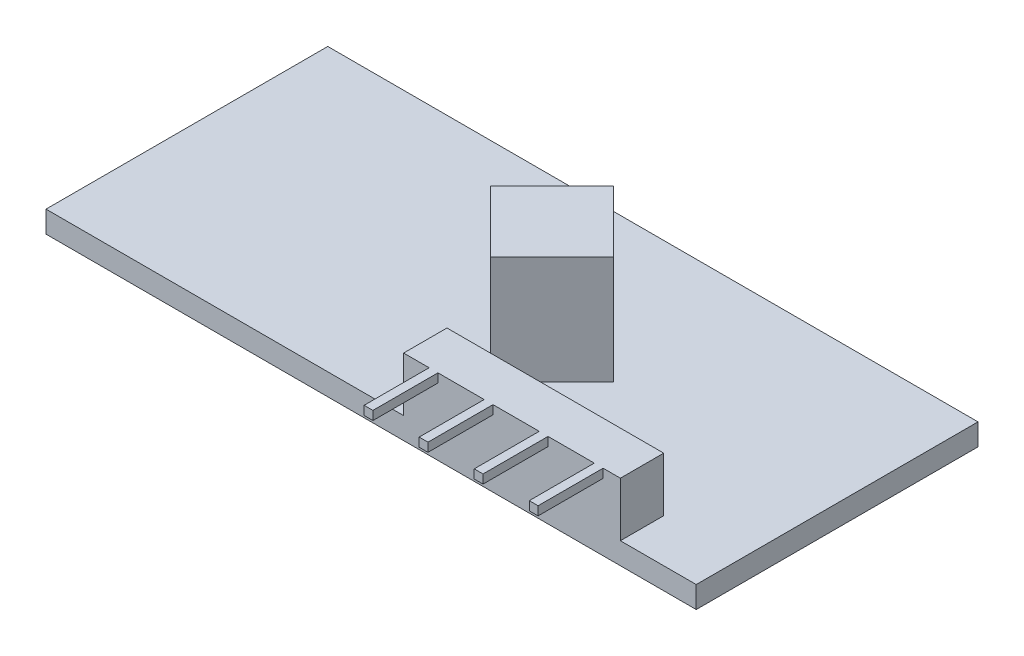
ISO-10303-21;
HEADER;
FILE_DESCRIPTION(('STEP AP214'),'2;1');
FILE_NAME('part.step','',(''),(''),'','','');
FILE_SCHEMA(('AUTOMOTIVE_DESIGN { 1 0 10303 214 1 1 1 1 }'));
ENDSEC;
DATA;
#1=APPLICATION_CONTEXT('core data for automotive mechanical design processes');
#2=APPLICATION_PROTOCOL_DEFINITION('international standard','automotive_design',2000,#1);
#3=PRODUCT_CONTEXT('',#1,'mechanical');
#4=PRODUCT('Part','Part','',(#3));
#5=PRODUCT_RELATED_PRODUCT_CATEGORY('part','',(#4));
#6=PRODUCT_DEFINITION_FORMATION('','',#4);
#7=PRODUCT_DEFINITION_CONTEXT('part definition',#1,'design');
#8=PRODUCT_DEFINITION('design','',#6,#7);
#9=PRODUCT_DEFINITION_SHAPE('','',#8);
#10=(LENGTH_UNIT() NAMED_UNIT(*) SI_UNIT(.MILLI.,.METRE.));
#11=(NAMED_UNIT(*) PLANE_ANGLE_UNIT() SI_UNIT($,.RADIAN.));
#12=(NAMED_UNIT(*) SI_UNIT($,.STERADIAN.) SOLID_ANGLE_UNIT());
#13=UNCERTAINTY_MEASURE_WITH_UNIT(LENGTH_MEASURE(1.E-05),#10,'distance_accuracy_value','');
#14=(GEOMETRIC_REPRESENTATION_CONTEXT(3) GLOBAL_UNCERTAINTY_ASSIGNED_CONTEXT((#13)) GLOBAL_UNIT_ASSIGNED_CONTEXT((#10,
#11,#12)) REPRESENTATION_CONTEXT('',''));
#15=CARTESIAN_POINT('',(0.,0.,0.));
#16=DIRECTION('',(0.,0.,1.));
#17=DIRECTION('',(1.,0.,0.));
#18=AXIS2_PLACEMENT_3D('',#15,#16,#17);
#19=CARTESIAN_POINT('',(0.,1.,0.));
#20=DIRECTION('',(0.,-1.,0.));
#21=DIRECTION('',(0.,0.,-1.));
#22=AXIS2_PLACEMENT_3D('',#19,#20,#21);
#23=PLANE('',#22);
#24=DIRECTION('',(0.,0.,-1.));
#25=VECTOR('',#24,1.);
#26=CARTESIAN_POINT('',(11.5,1.,4.5));
#27=LINE('',#26,#25);
#28=CARTESIAN_POINT('',(11.5,1.,6.5));
#29=VERTEX_POINT('',#28);
#30=CARTESIAN_POINT('',(11.5,1.,4.5));
#31=VERTEX_POINT('',#30);
#32=EDGE_CURVE('E436',#29,#31,#27,.T.);
#33=ORIENTED_EDGE('',*,*,#32,.F.);
#34=DIRECTION('',(1.,0.,0.));
#35=VECTOR('',#34,1.);
#36=CARTESIAN_POINT('',(-15.,1.,6.5));
#37=LINE('',#36,#35);
#38=CARTESIAN_POINT('',(15.,1.,6.5));
#39=VERTEX_POINT('',#38);
#40=EDGE_CURVE('E398',#29,#39,#37,.T.);
#41=ORIENTED_EDGE('',*,*,#40,.T.);
#42=DIRECTION('',(0.,0.,-1.));
#43=VECTOR('',#42,1.);
#44=CARTESIAN_POINT('',(15.,1.,6.5));
#45=LINE('',#44,#43);
#46=CARTESIAN_POINT('',(15.,1.,-6.5));
#47=VERTEX_POINT('',#46);
#48=EDGE_CURVE('E390',#39,#47,#45,.T.);
#49=ORIENTED_EDGE('',*,*,#48,.T.);
#50=DIRECTION('',(-1.,0.,0.));
#51=VECTOR('',#50,1.);
#52=CARTESIAN_POINT('',(-15.,1.,-6.5));
#53=LINE('',#52,#51);
#54=CARTESIAN_POINT('',(-15.,1.,-6.5));
#55=VERTEX_POINT('',#54);
#56=EDGE_CURVE('E393',#47,#55,#53,.T.);
#57=ORIENTED_EDGE('',*,*,#56,.T.);
#58=DIRECTION('',(0.,0.,1.));
#59=VECTOR('',#58,1.);
#60=CARTESIAN_POINT('',(-15.,1.,6.5));
#61=LINE('',#60,#59);
#62=CARTESIAN_POINT('',(-15.,1.,6.5));
#63=VERTEX_POINT('',#62);
#64=EDGE_CURVE('E396',#55,#63,#61,.T.);
#65=ORIENTED_EDGE('',*,*,#64,.T.);
#66=CARTESIAN_POINT('',(1.50000000000001,1.,6.5));
#67=VERTEX_POINT('',#66);
#68=EDGE_CURVE('E406',#63,#67,#37,.T.);
#69=ORIENTED_EDGE('',*,*,#68,.T.);
#70=DIRECTION('',(0.,0.,1.));
#71=VECTOR('',#70,1.);
#72=CARTESIAN_POINT('',(1.50000000000001,1.,4.5));
#73=LINE('',#72,#71);
#74=CARTESIAN_POINT('',(1.50000000000001,1.,4.5));
#75=VERTEX_POINT('',#74);
#76=EDGE_CURVE('E376',#75,#67,#73,.T.);
#77=ORIENTED_EDGE('',*,*,#76,.F.);
#78=DIRECTION('',(-1.,0.,0.));
#79=VECTOR('',#78,1.);
#80=CARTESIAN_POINT('',(1.50000000000001,1.,4.5));
#81=LINE('',#80,#79);
#82=EDGE_CURVE('E357',#31,#75,#81,.T.);
#83=ORIENTED_EDGE('',*,*,#82,.F.);
#84=EDGE_LOOP('',(#33,#41,#49,#57,#65,#69,#77,#83));
#85=FACE_BOUND('',#84,.T.);
#86=DIRECTION('',(-0.707106781186547,0.,0.707106781186548));
#87=VECTOR('',#86,1.);
#88=CARTESIAN_POINT('',(-0.656854249492376,1.,0.32842712474619));
#89=LINE('',#88,#87);
#90=CARTESIAN_POINT('',(2.17157287525381,1.,-2.5));
#91=VERTEX_POINT('',#90);
#92=CARTESIAN_POINT('',(-0.656854249492375,1.,0.32842712474619));
#93=VERTEX_POINT('',#92);
#94=EDGE_CURVE('E241',#91,#93,#89,.T.);
#95=ORIENTED_EDGE('',*,*,#94,.F.);
#96=DIRECTION('',(-0.707106781186547,0.,-0.707106781186547));
#97=VECTOR('',#96,1.);
#98=CARTESIAN_POINT('',(2.17157287525381,1.,-2.5));
#99=LINE('',#98,#97);
#100=CARTESIAN_POINT('',(5.,1.,0.32842712474619));
#101=VERTEX_POINT('',#100);
#102=EDGE_CURVE('E238',#101,#91,#99,.T.);
#103=ORIENTED_EDGE('',*,*,#102,.F.);
#104=DIRECTION('',(0.707106781186548,0.,-0.707106781186548));
#105=VECTOR('',#104,1.);
#106=CARTESIAN_POINT('',(2.17157287525382,1.,3.15685424949238));
#107=LINE('',#106,#105);
#108=CARTESIAN_POINT('',(2.17157287525382,1.,3.15685424949238));
#109=VERTEX_POINT('',#108);
#110=EDGE_CURVE('E56',#109,#101,#107,.T.);
#111=ORIENTED_EDGE('',*,*,#110,.F.);
#112=DIRECTION('',(0.707106781186548,0.,0.707106781186547));
#113=VECTOR('',#112,1.);
#114=CARTESIAN_POINT('',(-0.656854249492376,1.,0.32842712474619));
#115=LINE('',#114,#113);
#116=EDGE_CURVE('E51',#93,#109,#115,.T.);
#117=ORIENTED_EDGE('',*,*,#116,.F.);
#118=EDGE_LOOP('',(#95,#103,#111,#117));
#119=FACE_BOUND('',#118,.T.);
#120=ADVANCED_FACE('F33',(#85,#119),#23,.F.);
#121=CARTESIAN_POINT('',(-15.,1.,6.5));
#122=DIRECTION('',(0.,0.,-1.));
#123=DIRECTION('',(-1.,0.,0.));
#124=AXIS2_PLACEMENT_3D('',#121,#122,#123);
#125=PLANE('',#124);
#126=DIRECTION('',(0.,1.,0.));
#127=VECTOR('',#126,1.);
#128=CARTESIAN_POINT('',(3.08320000000001,3.0936,6.5));
#129=LINE('',#128,#127);
#130=CARTESIAN_POINT('',(3.08320000000001,3.0936,6.5));
#131=VERTEX_POINT('',#130);
#132=CARTESIAN_POINT('',(3.08320000000001,3.5,6.5));
#133=VERTEX_POINT('',#132);
#134=EDGE_CURVE('E242',#131,#133,#129,.T.);
#135=ORIENTED_EDGE('',*,*,#134,.F.);
#136=DIRECTION('',(1.,0.,0.));
#137=VECTOR('',#136,1.);
#138=CARTESIAN_POINT('',(2.67680000000001,3.0936,6.5));
#139=LINE('',#138,#137);
#140=CARTESIAN_POINT('',(2.67680000000001,3.0936,6.5));
#141=VERTEX_POINT('',#140);
#142=EDGE_CURVE('E254',#141,#131,#139,.T.);
#143=ORIENTED_EDGE('',*,*,#142,.F.);
#144=DIRECTION('',(0.,-1.,0.));
#145=VECTOR('',#144,1.);
#146=CARTESIAN_POINT('',(2.67680000000001,3.0936,6.5));
#147=LINE('',#146,#145);
#148=CARTESIAN_POINT('',(2.67680000000001,3.5,6.5));
#149=VERTEX_POINT('',#148);
#150=EDGE_CURVE('E244',#149,#141,#147,.T.);
#151=ORIENTED_EDGE('',*,*,#150,.F.);
#152=DIRECTION('',(1.,0.,0.));
#153=VECTOR('',#152,1.);
#154=CARTESIAN_POINT('',(1.50000000000001,3.5,6.5));
#155=LINE('',#154,#153);
#156=CARTESIAN_POINT('',(1.50000000000001,3.5,6.5));
#157=VERTEX_POINT('',#156);
#158=EDGE_CURVE('E366',#157,#149,#155,.T.);
#159=ORIENTED_EDGE('',*,*,#158,.F.);
#160=DIRECTION('',(0.,-1.,0.));
#161=VECTOR('',#160,1.);
#162=CARTESIAN_POINT('',(1.50000000000001,3.5,6.5));
#163=LINE('',#162,#161);
#164=EDGE_CURVE('E372',#157,#67,#163,.T.);
#165=ORIENTED_EDGE('',*,*,#164,.T.);
#166=ORIENTED_EDGE('',*,*,#68,.F.);
#167=DIRECTION('',(0.,-1.,0.));
#168=VECTOR('',#167,1.);
#169=CARTESIAN_POINT('',(-15.,1.,6.5));
#170=LINE('',#169,#168);
#171=CARTESIAN_POINT('',(-15.,0.,6.5));
#172=VERTEX_POINT('',#171);
#173=EDGE_CURVE('E411',#63,#172,#170,.T.);
#174=ORIENTED_EDGE('',*,*,#173,.T.);
#175=DIRECTION('',(1.,0.,0.));
#176=VECTOR('',#175,1.);
#177=CARTESIAN_POINT('',(-15.,0.,6.5));
#178=LINE('',#177,#176);
#179=CARTESIAN_POINT('',(15.,0.,6.5));
#180=VERTEX_POINT('',#179);
#181=EDGE_CURVE('E394',#172,#180,#178,.T.);
#182=ORIENTED_EDGE('',*,*,#181,.T.);
#183=DIRECTION('',(0.,-1.,0.));
#184=VECTOR('',#183,1.);
#185=CARTESIAN_POINT('',(15.,1.,6.5));
#186=LINE('',#185,#184);
#187=EDGE_CURVE('E407',#39,#180,#186,.T.);
#188=ORIENTED_EDGE('',*,*,#187,.F.);
#189=ORIENTED_EDGE('',*,*,#40,.F.);
#190=DIRECTION('',(0.,-1.,0.));
#191=VECTOR('',#190,1.);
#192=CARTESIAN_POINT('',(11.5,3.5,6.5));
#193=LINE('',#192,#191);
#194=CARTESIAN_POINT('',(11.5,3.5,6.5));
#195=VERTEX_POINT('',#194);
#196=EDGE_CURVE('E369',#195,#29,#193,.T.);
#197=ORIENTED_EDGE('',*,*,#196,.F.);
#198=CARTESIAN_POINT('',(10.7032,3.5,6.5));
#199=VERTEX_POINT('',#198);
#200=EDGE_CURVE('E351',#199,#195,#155,.T.);
#201=ORIENTED_EDGE('',*,*,#200,.F.);
#202=DIRECTION('',(0.,1.,0.));
#203=VECTOR('',#202,1.);
#204=CARTESIAN_POINT('',(10.7032,3.0936,6.5));
#205=LINE('',#204,#203);
#206=CARTESIAN_POINT('',(10.7032,3.0936,6.5));
#207=VERTEX_POINT('',#206);
#208=EDGE_CURVE('E327',#207,#199,#205,.T.);
#209=ORIENTED_EDGE('',*,*,#208,.F.);
#210=DIRECTION('',(1.,0.,0.));
#211=VECTOR('',#210,1.);
#212=CARTESIAN_POINT('',(10.2968,3.0936,6.5));
#213=LINE('',#212,#211);
#214=CARTESIAN_POINT('',(10.2968,3.0936,6.5));
#215=VERTEX_POINT('',#214);
#216=EDGE_CURVE('E332',#215,#207,#213,.T.);
#217=ORIENTED_EDGE('',*,*,#216,.F.);
#218=DIRECTION('',(0.,-1.,0.));
#219=VECTOR('',#218,1.);
#220=CARTESIAN_POINT('',(10.2968,3.0936,6.5));
#221=LINE('',#220,#219);
#222=CARTESIAN_POINT('',(10.2968,3.5,6.5));
#223=VERTEX_POINT('',#222);
#224=EDGE_CURVE('E346',#223,#215,#221,.T.);
#225=ORIENTED_EDGE('',*,*,#224,.F.);
#226=CARTESIAN_POINT('',(8.16320000000001,3.5,6.5));
#227=VERTEX_POINT('',#226);
#228=EDGE_CURVE('E349',#227,#223,#155,.T.);
#229=ORIENTED_EDGE('',*,*,#228,.F.);
#230=DIRECTION('',(0.,1.,0.));
#231=VECTOR('',#230,1.);
#232=CARTESIAN_POINT('',(8.16320000000001,3.0936,6.5));
#233=LINE('',#232,#231);
#234=CARTESIAN_POINT('',(8.16320000000001,3.0936,6.5));
#235=VERTEX_POINT('',#234);
#236=EDGE_CURVE('E300',#235,#227,#233,.T.);
#237=ORIENTED_EDGE('',*,*,#236,.F.);
#238=DIRECTION('',(1.,0.,0.));
#239=VECTOR('',#238,1.);
#240=CARTESIAN_POINT('',(7.75680000000001,3.0936,6.5));
#241=LINE('',#240,#239);
#242=CARTESIAN_POINT('',(7.75680000000001,3.0936,6.5));
#243=VERTEX_POINT('',#242);
#244=EDGE_CURVE('E305',#243,#235,#241,.T.);
#245=ORIENTED_EDGE('',*,*,#244,.F.);
#246=DIRECTION('',(0.,-1.,0.));
#247=VECTOR('',#246,1.);
#248=CARTESIAN_POINT('',(7.75680000000001,3.0936,6.5));
#249=LINE('',#248,#247);
#250=CARTESIAN_POINT('',(7.75680000000001,3.5,6.5));
#251=VERTEX_POINT('',#250);
#252=EDGE_CURVE('E313',#251,#243,#249,.T.);
#253=ORIENTED_EDGE('',*,*,#252,.F.);
#254=CARTESIAN_POINT('',(5.62320000000001,3.5,6.5));
#255=VERTEX_POINT('',#254);
#256=EDGE_CURVE('E350',#255,#251,#155,.T.);
#257=ORIENTED_EDGE('',*,*,#256,.F.);
#258=DIRECTION('',(0.,1.,0.));
#259=VECTOR('',#258,1.);
#260=CARTESIAN_POINT('',(5.62320000000001,3.0936,6.5));
#261=LINE('',#260,#259);
#262=CARTESIAN_POINT('',(5.62320000000001,3.0936,6.5));
#263=VERTEX_POINT('',#262);
#264=EDGE_CURVE('E273',#263,#255,#261,.T.);
#265=ORIENTED_EDGE('',*,*,#264,.F.);
#266=DIRECTION('',(1.,0.,0.));
#267=VECTOR('',#266,1.);
#268=CARTESIAN_POINT('',(5.21680000000001,3.0936,6.5));
#269=LINE('',#268,#267);
#270=CARTESIAN_POINT('',(5.21680000000001,3.0936,6.5));
#271=VERTEX_POINT('',#270);
#272=EDGE_CURVE('E278',#271,#263,#269,.T.);
#273=ORIENTED_EDGE('',*,*,#272,.F.);
#274=DIRECTION('',(0.,-1.,0.));
#275=VECTOR('',#274,1.);
#276=CARTESIAN_POINT('',(5.21680000000001,3.0936,6.5));
#277=LINE('',#276,#275);
#278=CARTESIAN_POINT('',(5.21680000000001,3.5,6.5));
#279=VERTEX_POINT('',#278);
#280=EDGE_CURVE('E286',#279,#271,#277,.T.);
#281=ORIENTED_EDGE('',*,*,#280,.F.);
#282=EDGE_CURVE('E37',#133,#279,#155,.T.);
#283=ORIENTED_EDGE('',*,*,#282,.F.);
#284=EDGE_LOOP('',(#135,#143,#151,#159,#165,#166,#174,#182,#188,#189,#197,#201,#209,#217,#225,
#229,#237,#245,#253,#257,#265,#273,#281,#283));
#285=FACE_BOUND('',#284,.T.);
#286=ADVANCED_FACE('F441',(#285),#125,.F.);
#287=CARTESIAN_POINT('',(15.,1.,6.5));
#288=DIRECTION('',(-1.,0.,0.));
#289=DIRECTION('',(0.,0.,1.));
#290=AXIS2_PLACEMENT_3D('',#287,#288,#289);
#291=PLANE('',#290);
#292=DIRECTION('',(0.,0.,-1.));
#293=VECTOR('',#292,1.);
#294=CARTESIAN_POINT('',(15.,0.,6.5));
#295=LINE('',#294,#293);
#296=CARTESIAN_POINT('',(15.,0.,-6.5));
#297=VERTEX_POINT('',#296);
#298=EDGE_CURVE('E389',#180,#297,#295,.T.);
#299=ORIENTED_EDGE('',*,*,#298,.T.);
#300=DIRECTION('',(0.,-1.,0.));
#301=VECTOR('',#300,1.);
#302=CARTESIAN_POINT('',(15.,1.,-6.5));
#303=LINE('',#302,#301);
#304=EDGE_CURVE('E11',#47,#297,#303,.T.);
#305=ORIENTED_EDGE('',*,*,#304,.F.);
#306=ORIENTED_EDGE('',*,*,#48,.F.);
#307=ORIENTED_EDGE('',*,*,#187,.T.);
#308=EDGE_LOOP('',(#299,#305,#306,#307));
#309=FACE_BOUND('',#308,.T.);
#310=ADVANCED_FACE('F35',(#309),#291,.F.);
#311=CARTESIAN_POINT('',(-15.,1.,-6.5));
#312=DIRECTION('',(0.,0.,1.));
#313=DIRECTION('',(1.,0.,0.));
#314=AXIS2_PLACEMENT_3D('',#311,#312,#313);
#315=PLANE('',#314);
#316=DIRECTION('',(-1.,0.,0.));
#317=VECTOR('',#316,1.);
#318=CARTESIAN_POINT('',(-15.,0.,-6.5));
#319=LINE('',#318,#317);
#320=CARTESIAN_POINT('',(-15.,0.,-6.5));
#321=VERTEX_POINT('',#320);
#322=EDGE_CURVE('E418',#297,#321,#319,.T.);
#323=ORIENTED_EDGE('',*,*,#322,.T.);
#324=DIRECTION('',(0.,-1.,0.));
#325=VECTOR('',#324,1.);
#326=CARTESIAN_POINT('',(-15.,1.,-6.5));
#327=LINE('',#326,#325);
#328=EDGE_CURVE('E43',#55,#321,#327,.T.);
#329=ORIENTED_EDGE('',*,*,#328,.F.);
#330=ORIENTED_EDGE('',*,*,#56,.F.);
#331=ORIENTED_EDGE('',*,*,#304,.T.);
#332=EDGE_LOOP('',(#323,#329,#330,#331));
#333=FACE_BOUND('',#332,.T.);
#334=ADVANCED_FACE('F431',(#333),#315,.F.);
#335=CARTESIAN_POINT('',(-15.,1.,6.5));
#336=DIRECTION('',(1.,0.,0.));
#337=DIRECTION('',(0.,0.,-1.));
#338=AXIS2_PLACEMENT_3D('',#335,#336,#337);
#339=PLANE('',#338);
#340=DIRECTION('',(0.,0.,1.));
#341=VECTOR('',#340,1.);
#342=CARTESIAN_POINT('',(-15.,0.,6.5));
#343=LINE('',#342,#341);
#344=EDGE_CURVE('E417',#321,#172,#343,.T.);
#345=ORIENTED_EDGE('',*,*,#344,.T.);
#346=ORIENTED_EDGE('',*,*,#173,.F.);
#347=ORIENTED_EDGE('',*,*,#64,.F.);
#348=ORIENTED_EDGE('',*,*,#328,.T.);
#349=EDGE_LOOP('',(#345,#346,#347,#348));
#350=FACE_BOUND('',#349,.T.);
#351=ADVANCED_FACE('F445',(#350),#339,.F.);
#352=CARTESIAN_POINT('',(0.,0.,0.));
#353=DIRECTION('',(0.,-1.,0.));
#354=DIRECTION('',(0.,0.,-1.));
#355=AXIS2_PLACEMENT_3D('',#352,#353,#354);
#356=PLANE('',#355);
#357=ORIENTED_EDGE('',*,*,#298,.F.);
#358=ORIENTED_EDGE('',*,*,#181,.F.);
#359=ORIENTED_EDGE('',*,*,#344,.F.);
#360=ORIENTED_EDGE('',*,*,#322,.F.);
#361=EDGE_LOOP('',(#357,#358,#359,#360));
#362=FACE_BOUND('',#361,.T.);
#363=ADVANCED_FACE('F429',(#362),#356,.T.);
#364=CARTESIAN_POINT('',(11.5,3.5,4.5));
#365=DIRECTION('',(-1.,0.,0.));
#366=DIRECTION('',(0.,0.,1.));
#367=AXIS2_PLACEMENT_3D('',#364,#365,#366);
#368=PLANE('',#367);
#369=ORIENTED_EDGE('',*,*,#32,.T.);
#370=DIRECTION('',(0.,-1.,0.));
#371=VECTOR('',#370,1.);
#372=CARTESIAN_POINT('',(11.5,3.5,4.5));
#373=LINE('',#372,#371);
#374=CARTESIAN_POINT('',(11.5,3.5,4.5));
#375=VERTEX_POINT('',#374);
#376=EDGE_CURVE('E386',#375,#31,#373,.T.);
#377=ORIENTED_EDGE('',*,*,#376,.F.);
#378=DIRECTION('',(0.,0.,-1.));
#379=VECTOR('',#378,1.);
#380=CARTESIAN_POINT('',(11.5,3.5,4.5));
#381=LINE('',#380,#379);
#382=EDGE_CURVE('E379',#195,#375,#381,.T.);
#383=ORIENTED_EDGE('',*,*,#382,.F.);
#384=ORIENTED_EDGE('',*,*,#196,.T.);
#385=EDGE_LOOP('',(#369,#377,#383,#384));
#386=FACE_BOUND('',#385,.T.);
#387=ADVANCED_FACE('F493',(#386),#368,.F.);
#388=CARTESIAN_POINT('',(1.50000000000001,3.5,4.5));
#389=DIRECTION('',(0.,0.,1.));
#390=DIRECTION('',(1.,0.,0.));
#391=AXIS2_PLACEMENT_3D('',#388,#389,#390);
#392=PLANE('',#391);
#393=ORIENTED_EDGE('',*,*,#82,.T.);
#394=DIRECTION('',(0.,-1.,0.));
#395=VECTOR('',#394,1.);
#396=CARTESIAN_POINT('',(1.50000000000001,3.5,4.5));
#397=LINE('',#396,#395);
#398=CARTESIAN_POINT('',(1.50000000000001,3.5,4.5));
#399=VERTEX_POINT('',#398);
#400=EDGE_CURVE('E375',#399,#75,#397,.T.);
#401=ORIENTED_EDGE('',*,*,#400,.F.);
#402=DIRECTION('',(-1.,0.,0.));
#403=VECTOR('',#402,1.);
#404=CARTESIAN_POINT('',(1.50000000000001,3.5,4.5));
#405=LINE('',#404,#403);
#406=EDGE_CURVE('E460',#375,#399,#405,.T.);
#407=ORIENTED_EDGE('',*,*,#406,.F.);
#408=ORIENTED_EDGE('',*,*,#376,.T.);
#409=EDGE_LOOP('',(#393,#401,#407,#408));
#410=FACE_BOUND('',#409,.T.);
#411=ADVANCED_FACE('F495',(#410),#392,.F.);
#412=CARTESIAN_POINT('',(1.50000000000001,3.5,4.5));
#413=DIRECTION('',(1.,0.,0.));
#414=DIRECTION('',(0.,0.,-1.));
#415=AXIS2_PLACEMENT_3D('',#412,#413,#414);
#416=PLANE('',#415);
#417=ORIENTED_EDGE('',*,*,#76,.T.);
#418=ORIENTED_EDGE('',*,*,#164,.F.);
#419=DIRECTION('',(0.,0.,1.));
#420=VECTOR('',#419,1.);
#421=CARTESIAN_POINT('',(1.50000000000001,3.5,4.5));
#422=LINE('',#421,#420);
#423=EDGE_CURVE('E355',#399,#157,#422,.T.);
#424=ORIENTED_EDGE('',*,*,#423,.F.);
#425=ORIENTED_EDGE('',*,*,#400,.T.);
#426=EDGE_LOOP('',(#417,#418,#424,#425));
#427=FACE_BOUND('',#426,.T.);
#428=ADVANCED_FACE('F449',(#427),#416,.F.);
#429=CARTESIAN_POINT('',(0.,3.5,0.));
#430=DIRECTION('',(0.,1.,0.));
#431=DIRECTION('',(0.,0.,1.));
#432=AXIS2_PLACEMENT_3D('',#429,#430,#431);
#433=PLANE('',#432);
#434=ORIENTED_EDGE('',*,*,#382,.T.);
#435=ORIENTED_EDGE('',*,*,#406,.T.);
#436=ORIENTED_EDGE('',*,*,#423,.T.);
#437=ORIENTED_EDGE('',*,*,#158,.T.);
#438=DIRECTION('',(0.,0.,-1.));
#439=VECTOR('',#438,1.);
#440=CARTESIAN_POINT('',(2.67680000000001,3.5,9.5));
#441=LINE('',#440,#439);
#442=CARTESIAN_POINT('',(2.67680000000001,3.5,9.5));
#443=VERTEX_POINT('',#442);
#444=EDGE_CURVE('E268',#443,#149,#441,.T.);
#445=ORIENTED_EDGE('',*,*,#444,.F.);
#446=DIRECTION('',(-1.,0.,0.));
#447=VECTOR('',#446,1.);
#448=CARTESIAN_POINT('',(2.67680000000001,3.5,9.5));
#449=LINE('',#448,#447);
#450=CARTESIAN_POINT('',(3.08320000000001,3.5,9.5));
#451=VERTEX_POINT('',#450);
#452=EDGE_CURVE('E253',#451,#443,#449,.T.);
#453=ORIENTED_EDGE('',*,*,#452,.F.);
#454=DIRECTION('',(0.,0.,-1.));
#455=VECTOR('',#454,1.);
#456=CARTESIAN_POINT('',(3.08320000000001,3.5,9.5));
#457=LINE('',#456,#455);
#458=EDGE_CURVE('E270',#451,#133,#457,.T.);
#459=ORIENTED_EDGE('',*,*,#458,.T.);
#460=ORIENTED_EDGE('',*,*,#282,.T.);
#461=DIRECTION('',(0.,0.,-1.));
#462=VECTOR('',#461,1.);
#463=CARTESIAN_POINT('',(5.21680000000001,3.5,9.5));
#464=LINE('',#463,#462);
#465=CARTESIAN_POINT('',(5.21680000000001,3.5,9.5));
#466=VERTEX_POINT('',#465);
#467=EDGE_CURVE('E294',#466,#279,#464,.T.);
#468=ORIENTED_EDGE('',*,*,#467,.F.);
#469=DIRECTION('',(-1.,0.,0.));
#470=VECTOR('',#469,1.);
#471=CARTESIAN_POINT('',(5.21680000000001,3.5,9.5));
#472=LINE('',#471,#470);
#473=CARTESIAN_POINT('',(5.62320000000001,3.5,9.5));
#474=VERTEX_POINT('',#473);
#475=EDGE_CURVE('E277',#474,#466,#472,.T.);
#476=ORIENTED_EDGE('',*,*,#475,.F.);
#477=DIRECTION('',(0.,0.,-1.));
#478=VECTOR('',#477,1.);
#479=CARTESIAN_POINT('',(5.62320000000001,3.5,9.5));
#480=LINE('',#479,#478);
#481=EDGE_CURVE('E297',#474,#255,#480,.T.);
#482=ORIENTED_EDGE('',*,*,#481,.T.);
#483=ORIENTED_EDGE('',*,*,#256,.T.);
#484=DIRECTION('',(0.,0.,-1.));
#485=VECTOR('',#484,1.);
#486=CARTESIAN_POINT('',(7.75680000000001,3.5,9.5));
#487=LINE('',#486,#485);
#488=CARTESIAN_POINT('',(7.75680000000001,3.5,9.5));
#489=VERTEX_POINT('',#488);
#490=EDGE_CURVE('E321',#489,#251,#487,.T.);
#491=ORIENTED_EDGE('',*,*,#490,.F.);
#492=DIRECTION('',(-1.,0.,0.));
#493=VECTOR('',#492,1.);
#494=CARTESIAN_POINT('',(7.75680000000001,3.5,9.5));
#495=LINE('',#494,#493);
#496=CARTESIAN_POINT('',(8.16320000000001,3.5,9.5));
#497=VERTEX_POINT('',#496);
#498=EDGE_CURVE('E304',#497,#489,#495,.T.);
#499=ORIENTED_EDGE('',*,*,#498,.F.);
#500=DIRECTION('',(0.,0.,-1.));
#501=VECTOR('',#500,1.);
#502=CARTESIAN_POINT('',(8.16320000000001,3.5,9.5));
#503=LINE('',#502,#501);
#504=EDGE_CURVE('E324',#497,#227,#503,.T.);
#505=ORIENTED_EDGE('',*,*,#504,.T.);
#506=ORIENTED_EDGE('',*,*,#228,.T.);
#507=DIRECTION('',(0.,0.,-1.));
#508=VECTOR('',#507,1.);
#509=CARTESIAN_POINT('',(10.2968,3.5,9.5));
#510=LINE('',#509,#508);
#511=CARTESIAN_POINT('',(10.2968,3.5,9.5));
#512=VERTEX_POINT('',#511);
#513=EDGE_CURVE('E465',#512,#223,#510,.T.);
#514=ORIENTED_EDGE('',*,*,#513,.F.);
#515=DIRECTION('',(-1.,0.,0.));
#516=VECTOR('',#515,1.);
#517=CARTESIAN_POINT('',(10.2968,3.5,9.5));
#518=LINE('',#517,#516);
#519=CARTESIAN_POINT('',(10.7032,3.5,9.5));
#520=VERTEX_POINT('',#519);
#521=EDGE_CURVE('E331',#520,#512,#518,.T.);
#522=ORIENTED_EDGE('',*,*,#521,.F.);
#523=DIRECTION('',(0.,0.,-1.));
#524=VECTOR('',#523,1.);
#525=CARTESIAN_POINT('',(10.7032,3.5,9.5));
#526=LINE('',#525,#524);
#527=EDGE_CURVE('E485',#520,#199,#526,.T.);
#528=ORIENTED_EDGE('',*,*,#527,.T.);
#529=ORIENTED_EDGE('',*,*,#200,.T.);
#530=EDGE_LOOP('',(#434,#435,#436,#437,#445,#453,#459,#460,#468,#476,#482,#483,#491,#499,#505,
#506,#514,#522,#528,#529));
#531=FACE_BOUND('',#530,.T.);
#532=ADVANCED_FACE('F458',(#531),#433,.T.);
#533=CARTESIAN_POINT('',(10.7032,3.0936,9.5));
#534=DIRECTION('',(-1.,0.,0.));
#535=DIRECTION('',(0.,0.,1.));
#536=AXIS2_PLACEMENT_3D('',#533,#534,#535);
#537=PLANE('',#536);
#538=ORIENTED_EDGE('',*,*,#208,.T.);
#539=ORIENTED_EDGE('',*,*,#527,.F.);
#540=DIRECTION('',(0.,1.,0.));
#541=VECTOR('',#540,1.);
#542=CARTESIAN_POINT('',(10.7032,3.0936,9.5));
#543=LINE('',#542,#541);
#544=CARTESIAN_POINT('',(10.7032,3.0936,9.5));
#545=VERTEX_POINT('',#544);
#546=EDGE_CURVE('E328',#545,#520,#543,.T.);
#547=ORIENTED_EDGE('',*,*,#546,.F.);
#548=DIRECTION('',(0.,0.,-1.));
#549=VECTOR('',#548,1.);
#550=CARTESIAN_POINT('',(10.7032,3.0936,9.5));
#551=LINE('',#550,#549);
#552=EDGE_CURVE('E338',#545,#207,#551,.T.);
#553=ORIENTED_EDGE('',*,*,#552,.T.);
#554=EDGE_LOOP('',(#538,#539,#547,#553));
#555=FACE_BOUND('',#554,.T.);
#556=ADVANCED_FACE('F470',(#555),#537,.F.);
#557=CARTESIAN_POINT('',(10.2968,3.0936,9.5));
#558=DIRECTION('',(1.,0.,0.));
#559=DIRECTION('',(0.,0.,-1.));
#560=AXIS2_PLACEMENT_3D('',#557,#558,#559);
#561=PLANE('',#560);
#562=ORIENTED_EDGE('',*,*,#224,.T.);
#563=DIRECTION('',(0.,0.,-1.));
#564=VECTOR('',#563,1.);
#565=CARTESIAN_POINT('',(10.2968,3.0936,9.5));
#566=LINE('',#565,#564);
#567=CARTESIAN_POINT('',(10.2968,3.0936,9.5));
#568=VERTEX_POINT('',#567);
#569=EDGE_CURVE('E463',#568,#215,#566,.T.);
#570=ORIENTED_EDGE('',*,*,#569,.F.);
#571=DIRECTION('',(0.,-1.,0.));
#572=VECTOR('',#571,1.);
#573=CARTESIAN_POINT('',(10.2968,3.0936,9.5));
#574=LINE('',#573,#572);
#575=EDGE_CURVE('E334',#512,#568,#574,.T.);
#576=ORIENTED_EDGE('',*,*,#575,.F.);
#577=ORIENTED_EDGE('',*,*,#513,.T.);
#578=EDGE_LOOP('',(#562,#570,#576,#577));
#579=FACE_BOUND('',#578,.T.);
#580=ADVANCED_FACE('F718',(#579),#561,.F.);
#581=CARTESIAN_POINT('',(10.2968,3.0936,9.5));
#582=DIRECTION('',(0.,1.,0.));
#583=DIRECTION('',(0.,0.,1.));
#584=AXIS2_PLACEMENT_3D('',#581,#582,#583);
#585=PLANE('',#584);
#586=ORIENTED_EDGE('',*,*,#216,.T.);
#587=ORIENTED_EDGE('',*,*,#552,.F.);
#588=DIRECTION('',(1.,0.,0.));
#589=VECTOR('',#588,1.);
#590=CARTESIAN_POINT('',(10.2968,3.0936,9.5));
#591=LINE('',#590,#589);
#592=EDGE_CURVE('E336',#568,#545,#591,.T.);
#593=ORIENTED_EDGE('',*,*,#592,.F.);
#594=ORIENTED_EDGE('',*,*,#569,.T.);
#595=EDGE_LOOP('',(#586,#587,#593,#594));
#596=FACE_BOUND('',#595,.T.);
#597=ADVANCED_FACE('F475',(#596),#585,.F.);
#598=CARTESIAN_POINT('',(0.,0.,9.5));
#599=DIRECTION('',(0.,0.,-1.));
#600=DIRECTION('',(-1.,0.,0.));
#601=AXIS2_PLACEMENT_3D('',#598,#599,#600);
#602=PLANE('',#601);
#603=ORIENTED_EDGE('',*,*,#546,.T.);
#604=ORIENTED_EDGE('',*,*,#521,.T.);
#605=ORIENTED_EDGE('',*,*,#575,.T.);
#606=ORIENTED_EDGE('',*,*,#592,.T.);
#607=EDGE_LOOP('',(#603,#604,#605,#606));
#608=FACE_BOUND('',#607,.T.);
#609=ADVANCED_FACE('F534',(#608),#602,.F.);
#610=CARTESIAN_POINT('',(8.16320000000001,3.0936,9.5));
#611=DIRECTION('',(-1.,0.,0.));
#612=DIRECTION('',(0.,0.,1.));
#613=AXIS2_PLACEMENT_3D('',#610,#611,#612);
#614=PLANE('',#613);
#615=ORIENTED_EDGE('',*,*,#236,.T.);
#616=ORIENTED_EDGE('',*,*,#504,.F.);
#617=DIRECTION('',(0.,1.,0.));
#618=VECTOR('',#617,1.);
#619=CARTESIAN_POINT('',(8.16320000000001,3.0936,9.5));
#620=LINE('',#619,#618);
#621=CARTESIAN_POINT('',(8.16320000000001,3.0936,9.5));
#622=VERTEX_POINT('',#621);
#623=EDGE_CURVE('E301',#622,#497,#620,.T.);
#624=ORIENTED_EDGE('',*,*,#623,.F.);
#625=DIRECTION('',(0.,0.,-1.));
#626=VECTOR('',#625,1.);
#627=CARTESIAN_POINT('',(8.16320000000001,3.0936,9.5));
#628=LINE('',#627,#626);
#629=EDGE_CURVE('E311',#622,#235,#628,.T.);
#630=ORIENTED_EDGE('',*,*,#629,.T.);
#631=EDGE_LOOP('',(#615,#616,#624,#630));
#632=FACE_BOUND('',#631,.T.);
#633=ADVANCED_FACE('F549',(#632),#614,.F.);
#634=CARTESIAN_POINT('',(7.75680000000001,3.0936,9.5));
#635=DIRECTION('',(1.,0.,0.));
#636=DIRECTION('',(0.,0.,-1.));
#637=AXIS2_PLACEMENT_3D('',#634,#635,#636);
#638=PLANE('',#637);
#639=ORIENTED_EDGE('',*,*,#252,.T.);
#640=DIRECTION('',(0.,0.,-1.));
#641=VECTOR('',#640,1.);
#642=CARTESIAN_POINT('',(7.75680000000001,3.0936,9.5));
#643=LINE('',#642,#641);
#644=CARTESIAN_POINT('',(7.75680000000001,3.0936,9.5));
#645=VERTEX_POINT('',#644);
#646=EDGE_CURVE('E318',#645,#243,#643,.T.);
#647=ORIENTED_EDGE('',*,*,#646,.F.);
#648=DIRECTION('',(0.,-1.,0.));
#649=VECTOR('',#648,1.);
#650=CARTESIAN_POINT('',(7.75680000000001,3.0936,9.5));
#651=LINE('',#650,#649);
#652=EDGE_CURVE('E307',#489,#645,#651,.T.);
#653=ORIENTED_EDGE('',*,*,#652,.F.);
#654=ORIENTED_EDGE('',*,*,#490,.T.);
#655=EDGE_LOOP('',(#639,#647,#653,#654));
#656=FACE_BOUND('',#655,.T.);
#657=ADVANCED_FACE('F553',(#656),#638,.F.);
#658=CARTESIAN_POINT('',(7.75680000000001,3.0936,9.5));
#659=DIRECTION('',(0.,1.,0.));
#660=DIRECTION('',(0.,0.,1.));
#661=AXIS2_PLACEMENT_3D('',#658,#659,#660);
#662=PLANE('',#661);
#663=ORIENTED_EDGE('',*,*,#244,.T.);
#664=ORIENTED_EDGE('',*,*,#629,.F.);
#665=DIRECTION('',(1.,0.,0.));
#666=VECTOR('',#665,1.);
#667=CARTESIAN_POINT('',(7.75680000000001,3.0936,9.5));
#668=LINE('',#667,#666);
#669=EDGE_CURVE('E309',#645,#622,#668,.T.);
#670=ORIENTED_EDGE('',*,*,#669,.F.);
#671=ORIENTED_EDGE('',*,*,#646,.T.);
#672=EDGE_LOOP('',(#663,#664,#670,#671));
#673=FACE_BOUND('',#672,.T.);
#674=ADVANCED_FACE('F563',(#673),#662,.F.);
#675=CARTESIAN_POINT('',(-2.54,0.,9.5));
#676=DIRECTION('',(0.,0.,-1.));
#677=DIRECTION('',(-1.,0.,0.));
#678=AXIS2_PLACEMENT_3D('',#675,#676,#677);
#679=PLANE('',#678);
#680=ORIENTED_EDGE('',*,*,#623,.T.);
#681=ORIENTED_EDGE('',*,*,#498,.T.);
#682=ORIENTED_EDGE('',*,*,#652,.T.);
#683=ORIENTED_EDGE('',*,*,#669,.T.);
#684=EDGE_LOOP('',(#680,#681,#682,#683));
#685=FACE_BOUND('',#684,.T.);
#686=ADVANCED_FACE('F573',(#685),#679,.F.);
#687=CARTESIAN_POINT('',(5.62320000000001,3.0936,9.5));
#688=DIRECTION('',(-1.,0.,0.));
#689=DIRECTION('',(0.,0.,1.));
#690=AXIS2_PLACEMENT_3D('',#687,#688,#689);
#691=PLANE('',#690);
#692=ORIENTED_EDGE('',*,*,#264,.T.);
#693=ORIENTED_EDGE('',*,*,#481,.F.);
#694=DIRECTION('',(0.,1.,0.));
#695=VECTOR('',#694,1.);
#696=CARTESIAN_POINT('',(5.62320000000001,3.0936,9.5));
#697=LINE('',#696,#695);
#698=CARTESIAN_POINT('',(5.62320000000001,3.0936,9.5));
#699=VERTEX_POINT('',#698);
#700=EDGE_CURVE('E274',#699,#474,#697,.T.);
#701=ORIENTED_EDGE('',*,*,#700,.F.);
#702=DIRECTION('',(0.,0.,-1.));
#703=VECTOR('',#702,1.);
#704=CARTESIAN_POINT('',(5.62320000000001,3.0936,9.5));
#705=LINE('',#704,#703);
#706=EDGE_CURVE('E284',#699,#263,#705,.T.);
#707=ORIENTED_EDGE('',*,*,#706,.T.);
#708=EDGE_LOOP('',(#692,#693,#701,#707));
#709=FACE_BOUND('',#708,.T.);
#710=ADVANCED_FACE('F583',(#709),#691,.F.);
#711=CARTESIAN_POINT('',(5.21680000000001,3.0936,9.5));
#712=DIRECTION('',(1.,0.,0.));
#713=DIRECTION('',(0.,0.,-1.));
#714=AXIS2_PLACEMENT_3D('',#711,#712,#713);
#715=PLANE('',#714);
#716=ORIENTED_EDGE('',*,*,#280,.T.);
#717=DIRECTION('',(0.,0.,-1.));
#718=VECTOR('',#717,1.);
#719=CARTESIAN_POINT('',(5.21680000000001,3.0936,9.5));
#720=LINE('',#719,#718);
#721=CARTESIAN_POINT('',(5.21680000000001,3.0936,9.5));
#722=VERTEX_POINT('',#721);
#723=EDGE_CURVE('E291',#722,#271,#720,.T.);
#724=ORIENTED_EDGE('',*,*,#723,.F.);
#725=DIRECTION('',(0.,-1.,0.));
#726=VECTOR('',#725,1.);
#727=CARTESIAN_POINT('',(5.21680000000001,3.0936,9.5));
#728=LINE('',#727,#726);
#729=EDGE_CURVE('E280',#466,#722,#728,.T.);
#730=ORIENTED_EDGE('',*,*,#729,.F.);
#731=ORIENTED_EDGE('',*,*,#467,.T.);
#732=EDGE_LOOP('',(#716,#724,#730,#731));
#733=FACE_BOUND('',#732,.T.);
#734=ADVANCED_FACE('F593',(#733),#715,.F.);
#735=CARTESIAN_POINT('',(5.21680000000001,3.0936,9.5));
#736=DIRECTION('',(0.,1.,0.));
#737=DIRECTION('',(0.,0.,1.));
#738=AXIS2_PLACEMENT_3D('',#735,#736,#737);
#739=PLANE('',#738);
#740=ORIENTED_EDGE('',*,*,#272,.T.);
#741=ORIENTED_EDGE('',*,*,#706,.F.);
#742=DIRECTION('',(1.,0.,0.));
#743=VECTOR('',#742,1.);
#744=CARTESIAN_POINT('',(5.21680000000001,3.0936,9.5));
#745=LINE('',#744,#743);
#746=EDGE_CURVE('E282',#722,#699,#745,.T.);
#747=ORIENTED_EDGE('',*,*,#746,.F.);
#748=ORIENTED_EDGE('',*,*,#723,.T.);
#749=EDGE_LOOP('',(#740,#741,#747,#748));
#750=FACE_BOUND('',#749,.T.);
#751=ADVANCED_FACE('F603',(#750),#739,.F.);
#752=CARTESIAN_POINT('',(-5.08,0.,9.5));
#753=DIRECTION('',(0.,0.,-1.));
#754=DIRECTION('',(-1.,0.,0.));
#755=AXIS2_PLACEMENT_3D('',#752,#753,#754);
#756=PLANE('',#755);
#757=ORIENTED_EDGE('',*,*,#700,.T.);
#758=ORIENTED_EDGE('',*,*,#475,.T.);
#759=ORIENTED_EDGE('',*,*,#729,.T.);
#760=ORIENTED_EDGE('',*,*,#746,.T.);
#761=EDGE_LOOP('',(#757,#758,#759,#760));
#762=FACE_BOUND('',#761,.T.);
#763=ADVANCED_FACE('F613',(#762),#756,.F.);
#764=CARTESIAN_POINT('',(3.08320000000001,3.0936,9.5));
#765=DIRECTION('',(-1.,0.,0.));
#766=DIRECTION('',(0.,0.,1.));
#767=AXIS2_PLACEMENT_3D('',#764,#765,#766);
#768=PLANE('',#767);
#769=ORIENTED_EDGE('',*,*,#134,.T.);
#770=ORIENTED_EDGE('',*,*,#458,.F.);
#771=DIRECTION('',(0.,1.,0.));
#772=VECTOR('',#771,1.);
#773=CARTESIAN_POINT('',(3.08320000000001,3.0936,9.5));
#774=LINE('',#773,#772);
#775=CARTESIAN_POINT('',(3.08320000000001,3.0936,9.5));
#776=VERTEX_POINT('',#775);
#777=EDGE_CURVE('E250',#776,#451,#774,.T.);
#778=ORIENTED_EDGE('',*,*,#777,.F.);
#779=DIRECTION('',(0.,0.,-1.));
#780=VECTOR('',#779,1.);
#781=CARTESIAN_POINT('',(3.08320000000001,3.0936,9.5));
#782=LINE('',#781,#780);
#783=EDGE_CURVE('E259',#776,#131,#782,.T.);
#784=ORIENTED_EDGE('',*,*,#783,.T.);
#785=EDGE_LOOP('',(#769,#770,#778,#784));
#786=FACE_BOUND('',#785,.T.);
#787=ADVANCED_FACE('F623',(#786),#768,.F.);
#788=CARTESIAN_POINT('',(2.67680000000001,3.0936,9.5));
#789=DIRECTION('',(1.,0.,0.));
#790=DIRECTION('',(0.,0.,-1.));
#791=AXIS2_PLACEMENT_3D('',#788,#789,#790);
#792=PLANE('',#791);
#793=ORIENTED_EDGE('',*,*,#150,.T.);
#794=DIRECTION('',(0.,0.,-1.));
#795=VECTOR('',#794,1.);
#796=CARTESIAN_POINT('',(2.67680000000001,3.0936,9.5));
#797=LINE('',#796,#795);
#798=CARTESIAN_POINT('',(2.67680000000001,3.0936,9.5));
#799=VERTEX_POINT('',#798);
#800=EDGE_CURVE('E265',#799,#141,#797,.T.);
#801=ORIENTED_EDGE('',*,*,#800,.F.);
#802=DIRECTION('',(0.,-1.,0.));
#803=VECTOR('',#802,1.);
#804=CARTESIAN_POINT('',(2.67680000000001,3.0936,9.5));
#805=LINE('',#804,#803);
#806=EDGE_CURVE('E256',#443,#799,#805,.T.);
#807=ORIENTED_EDGE('',*,*,#806,.F.);
#808=ORIENTED_EDGE('',*,*,#444,.T.);
#809=EDGE_LOOP('',(#793,#801,#807,#808));
#810=FACE_BOUND('',#809,.T.);
#811=ADVANCED_FACE('F633',(#810),#792,.F.);
#812=CARTESIAN_POINT('',(2.67680000000001,3.0936,9.5));
#813=DIRECTION('',(0.,1.,0.));
#814=DIRECTION('',(0.,0.,1.));
#815=AXIS2_PLACEMENT_3D('',#812,#813,#814);
#816=PLANE('',#815);
#817=ORIENTED_EDGE('',*,*,#142,.T.);
#818=ORIENTED_EDGE('',*,*,#783,.F.);
#819=DIRECTION('',(1.,0.,0.));
#820=VECTOR('',#819,1.);
#821=CARTESIAN_POINT('',(2.67680000000001,3.0936,9.5));
#822=LINE('',#821,#820);
#823=EDGE_CURVE('E258',#799,#776,#822,.T.);
#824=ORIENTED_EDGE('',*,*,#823,.F.);
#825=ORIENTED_EDGE('',*,*,#800,.T.);
#826=EDGE_LOOP('',(#817,#818,#824,#825));
#827=FACE_BOUND('',#826,.T.);
#828=ADVANCED_FACE('F643',(#827),#816,.F.);
#829=CARTESIAN_POINT('',(-7.62,0.,9.5));
#830=DIRECTION('',(0.,0.,-1.));
#831=DIRECTION('',(-1.,0.,0.));
#832=AXIS2_PLACEMENT_3D('',#829,#830,#831);
#833=PLANE('',#832);
#834=ORIENTED_EDGE('',*,*,#777,.T.);
#835=ORIENTED_EDGE('',*,*,#452,.T.);
#836=ORIENTED_EDGE('',*,*,#806,.T.);
#837=ORIENTED_EDGE('',*,*,#823,.T.);
#838=EDGE_LOOP('',(#834,#835,#836,#837));
#839=FACE_BOUND('',#838,.T.);
#840=ADVANCED_FACE('F652',(#839),#833,.F.);
#841=CARTESIAN_POINT('',(-0.656854249492376,6.,0.32842712474619));
#842=DIRECTION('',(0.707106781186548,0.,0.707106781186547));
#843=DIRECTION('',(0.707106781186547,0.,-0.707106781186548));
#844=AXIS2_PLACEMENT_3D('',#841,#842,#843);
#845=PLANE('',#844);
#846=ORIENTED_EDGE('',*,*,#94,.T.);
#847=DIRECTION('',(0.,-1.,0.));
#848=VECTOR('',#847,1.);
#849=CARTESIAN_POINT('',(-0.656854249492376,6.,0.32842712474619));
#850=LINE('',#849,#848);
#851=CARTESIAN_POINT('',(-0.656854249492376,6.,0.32842712474619));
#852=VERTEX_POINT('',#851);
#853=EDGE_CURVE('E222',#852,#93,#850,.T.);
#854=ORIENTED_EDGE('',*,*,#853,.F.);
#855=DIRECTION('',(-0.707106781186547,0.,0.707106781186548));
#856=VECTOR('',#855,1.);
#857=CARTESIAN_POINT('',(-0.656854249492376,6.,0.32842712474619));
#858=LINE('',#857,#856);
#859=CARTESIAN_POINT('',(2.17157287525381,6.,-2.5));
#860=VERTEX_POINT('',#859);
#861=EDGE_CURVE('E229',#860,#852,#858,.T.);
#862=ORIENTED_EDGE('',*,*,#861,.F.);
#863=DIRECTION('',(0.,-1.,0.));
#864=VECTOR('',#863,1.);
#865=CARTESIAN_POINT('',(2.17157287525381,6.,-2.5));
#866=LINE('',#865,#864);
#867=EDGE_CURVE('E814',#860,#91,#866,.T.);
#868=ORIENTED_EDGE('',*,*,#867,.T.);
#869=EDGE_LOOP('',(#846,#854,#862,#868));
#870=FACE_BOUND('',#869,.T.);
#871=ADVANCED_FACE('F240',(#870),#845,.F.);
#872=CARTESIAN_POINT('',(-0.656854249492376,6.,0.32842712474619));
#873=DIRECTION('',(0.707106781186547,0.,-0.707106781186548));
#874=DIRECTION('',(-0.707106781186548,0.,-0.707106781186547));
#875=AXIS2_PLACEMENT_3D('',#872,#873,#874);
#876=PLANE('',#875);
#877=ORIENTED_EDGE('',*,*,#116,.T.);
#878=DIRECTION('',(0.,-1.,0.));
#879=VECTOR('',#878,1.);
#880=CARTESIAN_POINT('',(2.17157287525382,6.,3.15685424949238));
#881=LINE('',#880,#879);
#882=CARTESIAN_POINT('',(2.17157287525382,6.,3.15685424949238));
#883=VERTEX_POINT('',#882);
#884=EDGE_CURVE('E225',#883,#109,#881,.T.);
#885=ORIENTED_EDGE('',*,*,#884,.F.);
#886=DIRECTION('',(0.707106781186548,0.,0.707106781186547));
#887=VECTOR('',#886,1.);
#888=CARTESIAN_POINT('',(-0.656854249492376,6.,0.32842712474619));
#889=LINE('',#888,#887);
#890=EDGE_CURVE('E218',#852,#883,#889,.T.);
#891=ORIENTED_EDGE('',*,*,#890,.F.);
#892=ORIENTED_EDGE('',*,*,#853,.T.);
#893=EDGE_LOOP('',(#877,#885,#891,#892));
#894=FACE_BOUND('',#893,.T.);
#895=ADVANCED_FACE('F220',(#894),#876,.F.);
#896=CARTESIAN_POINT('',(2.17157287525382,6.,3.15685424949238));
#897=DIRECTION('',(-0.707106781186548,0.,-0.707106781186548));
#898=DIRECTION('',(-0.707106781186548,0.,0.707106781186548));
#899=AXIS2_PLACEMENT_3D('',#896,#897,#898);
#900=PLANE('',#899);
#901=ORIENTED_EDGE('',*,*,#110,.T.);
#902=DIRECTION('',(0.,-1.,0.));
#903=VECTOR('',#902,1.);
#904=CARTESIAN_POINT('',(5.,6.,0.32842712474619));
#905=LINE('',#904,#903);
#906=CARTESIAN_POINT('',(5.,6.,0.32842712474619));
#907=VERTEX_POINT('',#906);
#908=EDGE_CURVE('E246',#907,#101,#905,.T.);
#909=ORIENTED_EDGE('',*,*,#908,.F.);
#910=DIRECTION('',(0.707106781186548,0.,-0.707106781186548));
#911=VECTOR('',#910,1.);
#912=CARTESIAN_POINT('',(2.17157287525382,6.,3.15685424949238));
#913=LINE('',#912,#911);
#914=EDGE_CURVE('E228',#883,#907,#913,.T.);
#915=ORIENTED_EDGE('',*,*,#914,.F.);
#916=ORIENTED_EDGE('',*,*,#884,.T.);
#917=EDGE_LOOP('',(#901,#909,#915,#916));
#918=FACE_BOUND('',#917,.T.);
#919=ADVANCED_FACE('F679',(#918),#900,.F.);
#920=CARTESIAN_POINT('',(2.17157287525381,6.,-2.5));
#921=DIRECTION('',(-0.707106781186548,0.,0.707106781186548));
#922=DIRECTION('',(0.707106781186548,0.,0.707106781186548));
#923=AXIS2_PLACEMENT_3D('',#920,#921,#922);
#924=PLANE('',#923);
#925=ORIENTED_EDGE('',*,*,#102,.T.);
#926=ORIENTED_EDGE('',*,*,#867,.F.);
#927=DIRECTION('',(-0.707106781186547,0.,-0.707106781186547));
#928=VECTOR('',#927,1.);
#929=CARTESIAN_POINT('',(2.17157287525381,6.,-2.5));
#930=LINE('',#929,#928);
#931=EDGE_CURVE('E234',#907,#860,#930,.T.);
#932=ORIENTED_EDGE('',*,*,#931,.F.);
#933=ORIENTED_EDGE('',*,*,#908,.T.);
#934=EDGE_LOOP('',(#925,#926,#932,#933));
#935=FACE_BOUND('',#934,.T.);
#936=ADVANCED_FACE('F686',(#935),#924,.F.);
#937=CARTESIAN_POINT('',(0.,6.,0.));
#938=DIRECTION('',(0.,-1.,0.));
#939=DIRECTION('',(0.,0.,-1.));
#940=AXIS2_PLACEMENT_3D('',#937,#938,#939);
#941=PLANE('',#940);
#942=ORIENTED_EDGE('',*,*,#861,.T.);
#943=ORIENTED_EDGE('',*,*,#890,.T.);
#944=ORIENTED_EDGE('',*,*,#914,.T.);
#945=ORIENTED_EDGE('',*,*,#931,.T.);
#946=EDGE_LOOP('',(#942,#943,#944,#945));
#947=FACE_BOUND('',#946,.T.);
#948=ADVANCED_FACE('F232',(#947),#941,.F.);
#949=CLOSED_SHELL('',(#120,#286,#310,#334,#351,#363,#387,#411,#428,#532,#556,#580,#597,#609,
#633,#657,#674,#686,#710,#734,#751,#763,#787,#811,#828,#840,#871,#895,#919,#936,#948));
#950=MANIFOLD_SOLID_BREP('B2',#949);
#951=ADVANCED_BREP_SHAPE_REPRESENTATION('',(#18,#950),#14);
#952=SHAPE_DEFINITION_REPRESENTATION(#9,#951);
ENDSEC;
END-ISO-10303-21;
